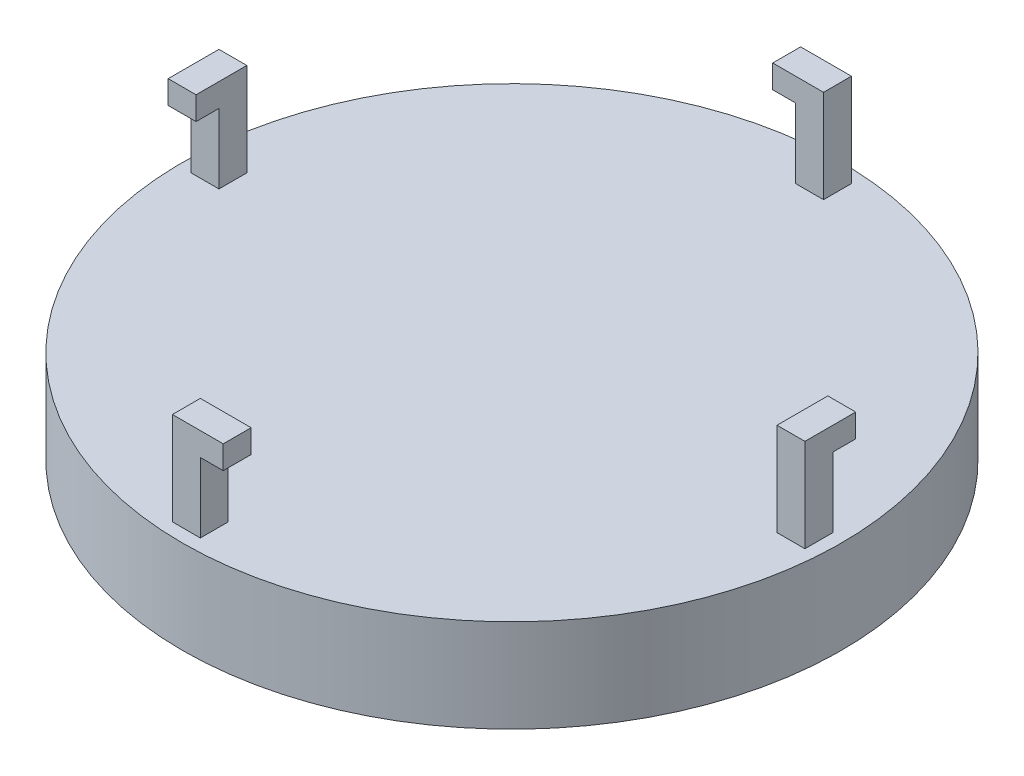
ISO-10303-21;
HEADER;
FILE_DESCRIPTION(('STEP AP214'),'2;1');
FILE_NAME('part.step','',(''),(''),'','','');
FILE_SCHEMA(('AUTOMOTIVE_DESIGN { 1 0 10303 214 1 1 1 1 }'));
ENDSEC;
DATA;
#1=APPLICATION_CONTEXT('core data for automotive mechanical design processes');
#2=APPLICATION_PROTOCOL_DEFINITION('international standard','automotive_design',2000,#1);
#3=PRODUCT_CONTEXT('',#1,'mechanical');
#4=PRODUCT('Part','Part','',(#3));
#5=PRODUCT_RELATED_PRODUCT_CATEGORY('part','',(#4));
#6=PRODUCT_DEFINITION_FORMATION('','',#4);
#7=PRODUCT_DEFINITION_CONTEXT('part definition',#1,'design');
#8=PRODUCT_DEFINITION('design','',#6,#7);
#9=PRODUCT_DEFINITION_SHAPE('','',#8);
#10=(LENGTH_UNIT() NAMED_UNIT(*) SI_UNIT(.MILLI.,.METRE.));
#11=(NAMED_UNIT(*) PLANE_ANGLE_UNIT() SI_UNIT($,.RADIAN.));
#12=(NAMED_UNIT(*) SI_UNIT($,.STERADIAN.) SOLID_ANGLE_UNIT());
#13=UNCERTAINTY_MEASURE_WITH_UNIT(LENGTH_MEASURE(1.E-05),#10,'distance_accuracy_value','');
#14=(GEOMETRIC_REPRESENTATION_CONTEXT(3) GLOBAL_UNCERTAINTY_ASSIGNED_CONTEXT((#13)) GLOBAL_UNIT_ASSIGNED_CONTEXT((#10,
#11,#12)) REPRESENTATION_CONTEXT('',''));
#15=CARTESIAN_POINT('',(0.,0.,0.));
#16=DIRECTION('',(0.,0.,1.));
#17=DIRECTION('',(1.,0.,0.));
#18=AXIS2_PLACEMENT_3D('',#15,#16,#17);
#19=CARTESIAN_POINT('',(-0.635000000000452,25.4,-43.18));
#20=DIRECTION('',(1.,0.,0.));
#21=DIRECTION('',(0.,0.,-1.));
#22=AXIS2_PLACEMENT_3D('',#19,#20,#21);
#23=PLANE('',#22);
#24=DIRECTION('',(0.,0.,1.));
#25=VECTOR('',#24,1.);
#26=CARTESIAN_POINT('',(-0.635000000000452,22.225,-43.18));
#27=LINE('',#26,#25);
#28=CARTESIAN_POINT('',(-0.635000000000452,22.225,-43.18));
#29=VERTEX_POINT('',#28);
#30=CARTESIAN_POINT('',(-0.635000000000412,22.225,-39.37));
#31=VERTEX_POINT('',#30);
#32=EDGE_CURVE('E240',#29,#31,#27,.T.);
#33=ORIENTED_EDGE('',*,*,#32,.F.);
#34=DIRECTION('',(0.,-1.,0.));
#35=VECTOR('',#34,1.);
#36=CARTESIAN_POINT('',(-0.635000000000452,25.4,-43.18));
#37=LINE('',#36,#35);
#38=CARTESIAN_POINT('',(-0.635000000000452,12.7,-43.18));
#39=VERTEX_POINT('',#38);
#40=EDGE_CURVE('E61',#29,#39,#37,.T.);
#41=ORIENTED_EDGE('',*,*,#40,.T.);
#42=DIRECTION('',(0.,0.,1.));
#43=VECTOR('',#42,1.);
#44=CARTESIAN_POINT('',(-0.635000000000452,12.7,-43.18));
#45=LINE('',#44,#43);
#46=CARTESIAN_POINT('',(-0.635000000000412,12.7,-39.37));
#47=VERTEX_POINT('',#46);
#48=EDGE_CURVE('E223',#39,#47,#45,.T.);
#49=ORIENTED_EDGE('',*,*,#48,.T.);
#50=DIRECTION('',(0.,-1.,0.));
#51=VECTOR('',#50,1.);
#52=CARTESIAN_POINT('',(-0.635000000000412,25.4,-39.37));
#53=LINE('',#52,#51);
#54=EDGE_CURVE('E308',#31,#47,#53,.T.);
#55=ORIENTED_EDGE('',*,*,#54,.F.);
#56=EDGE_LOOP('',(#33,#41,#49,#55));
#57=FACE_BOUND('',#56,.T.);
#58=ADVANCED_FACE('F45',(#57),#23,.F.);
#59=CARTESIAN_POINT('',(43.18,25.4,-0.635));
#60=DIRECTION('',(0.,0.,1.));
#61=DIRECTION('',(1.,0.,0.));
#62=AXIS2_PLACEMENT_3D('',#59,#60,#61);
#63=PLANE('',#62);
#64=DIRECTION('',(-1.,0.,0.));
#65=VECTOR('',#64,1.);
#66=CARTESIAN_POINT('',(43.18,22.225,-0.635));
#67=LINE('',#66,#65);
#68=CARTESIAN_POINT('',(43.18,22.225,-0.635));
#69=VERTEX_POINT('',#68);
#70=CARTESIAN_POINT('',(39.37,22.225,-0.635));
#71=VERTEX_POINT('',#70);
#72=EDGE_CURVE('E255',#69,#71,#67,.T.);
#73=ORIENTED_EDGE('',*,*,#72,.F.);
#74=DIRECTION('',(0.,-1.,0.));
#75=VECTOR('',#74,1.);
#76=CARTESIAN_POINT('',(43.18,25.4,-0.635));
#77=LINE('',#76,#75);
#78=CARTESIAN_POINT('',(43.18,12.7,-0.635));
#79=VERTEX_POINT('',#78);
#80=EDGE_CURVE('E69',#69,#79,#77,.T.);
#81=ORIENTED_EDGE('',*,*,#80,.T.);
#82=DIRECTION('',(-1.,0.,0.));
#83=VECTOR('',#82,1.);
#84=CARTESIAN_POINT('',(43.18,12.7,-0.635));
#85=LINE('',#84,#83);
#86=CARTESIAN_POINT('',(39.37,12.7,-0.635));
#87=VERTEX_POINT('',#86);
#88=EDGE_CURVE('E335',#79,#87,#85,.T.);
#89=ORIENTED_EDGE('',*,*,#88,.T.);
#90=DIRECTION('',(0.,-1.,0.));
#91=VECTOR('',#90,1.);
#92=CARTESIAN_POINT('',(39.37,25.4,-0.635));
#93=LINE('',#92,#91);
#94=EDGE_CURVE('E341',#71,#87,#93,.T.);
#95=ORIENTED_EDGE('',*,*,#94,.F.);
#96=EDGE_LOOP('',(#73,#81,#89,#95));
#97=FACE_BOUND('',#96,.T.);
#98=ADVANCED_FACE('F484',(#97),#63,.F.);
#99=CARTESIAN_POINT('',(0.635000000000151,25.4,43.18));
#100=DIRECTION('',(-1.,0.,0.));
#101=DIRECTION('',(0.,0.,1.));
#102=AXIS2_PLACEMENT_3D('',#99,#100,#101);
#103=PLANE('',#102);
#104=DIRECTION('',(0.,0.,-1.));
#105=VECTOR('',#104,1.);
#106=CARTESIAN_POINT('',(0.635000000000151,22.225,43.18));
#107=LINE('',#106,#105);
#108=CARTESIAN_POINT('',(0.635000000000151,22.225,43.18));
#109=VERTEX_POINT('',#108);
#110=CARTESIAN_POINT('',(0.635000000000137,22.225,39.37));
#111=VERTEX_POINT('',#110);
#112=EDGE_CURVE('E279',#109,#111,#107,.T.);
#113=ORIENTED_EDGE('',*,*,#112,.F.);
#114=DIRECTION('',(0.,-1.,0.));
#115=VECTOR('',#114,1.);
#116=CARTESIAN_POINT('',(0.635000000000151,25.4,43.18));
#117=LINE('',#116,#115);
#118=CARTESIAN_POINT('',(0.635000000000151,12.7,43.18));
#119=VERTEX_POINT('',#118);
#120=EDGE_CURVE('E392',#109,#119,#117,.T.);
#121=ORIENTED_EDGE('',*,*,#120,.T.);
#122=DIRECTION('',(0.,0.,-1.));
#123=VECTOR('',#122,1.);
#124=CARTESIAN_POINT('',(0.635000000000151,12.7,43.18));
#125=LINE('',#124,#123);
#126=CARTESIAN_POINT('',(0.635000000000137,12.7,39.37));
#127=VERTEX_POINT('',#126);
#128=EDGE_CURVE('E370',#119,#127,#125,.T.);
#129=ORIENTED_EDGE('',*,*,#128,.T.);
#130=DIRECTION('',(0.,-1.,0.));
#131=VECTOR('',#130,1.);
#132=CARTESIAN_POINT('',(0.635000000000137,25.4,39.37));
#133=LINE('',#132,#131);
#134=EDGE_CURVE('E376',#111,#127,#133,.T.);
#135=ORIENTED_EDGE('',*,*,#134,.F.);
#136=EDGE_LOOP('',(#113,#121,#129,#135));
#137=FACE_BOUND('',#136,.T.);
#138=ADVANCED_FACE('F489',(#137),#103,.F.);
#139=CARTESIAN_POINT('',(0.,12.7,0.));
#140=DIRECTION('',(0.,1.,0.));
#141=DIRECTION('',(0.,0.,1.));
#142=AXIS2_PLACEMENT_3D('',#139,#140,#141);
#143=PLANE('',#142);
#144=CARTESIAN_POINT('',(0.,12.7,0.));
#145=DIRECTION('',(0.,1.,0.));
#146=DIRECTION('',(0.,0.,1.));
#147=AXIS2_PLACEMENT_3D('',#144,#145,#146);
#148=CIRCLE('',#147,45.);
#149=CARTESIAN_POINT('',(0.,12.7,45.));
#150=VERTEX_POINT('',#149);
#151=EDGE_CURVE('E11',#150,#150,#148,.T.);
#152=ORIENTED_EDGE('',*,*,#151,.T.);
#153=EDGE_LOOP('',(#152));
#154=FACE_BOUND('',#153,.T.);
#155=DIRECTION('',(-1.,0.,0.));
#156=VECTOR('',#155,1.);
#157=CARTESIAN_POINT('',(-43.18,12.7,-3.175));
#158=LINE('',#157,#156);
#159=CARTESIAN_POINT('',(-39.37,12.7,-3.175));
#160=VERTEX_POINT('',#159);
#161=CARTESIAN_POINT('',(-43.18,12.7,-3.175));
#162=VERTEX_POINT('',#161);
#163=EDGE_CURVE('E442',#160,#162,#158,.T.);
#164=ORIENTED_EDGE('',*,*,#163,.F.);
#165=DIRECTION('',(0.,0.,-1.));
#166=VECTOR('',#165,1.);
#167=CARTESIAN_POINT('',(-39.37,12.7,-3.175));
#168=LINE('',#167,#166);
#169=CARTESIAN_POINT('',(-39.37,12.7,0.635));
#170=VERTEX_POINT('',#169);
#171=EDGE_CURVE('E426',#170,#160,#168,.T.);
#172=ORIENTED_EDGE('',*,*,#171,.F.);
#173=DIRECTION('',(1.,0.,0.));
#174=VECTOR('',#173,1.);
#175=CARTESIAN_POINT('',(-43.18,12.7,0.635));
#176=LINE('',#175,#174);
#177=CARTESIAN_POINT('',(-43.18,12.7,0.635));
#178=VERTEX_POINT('',#177);
#179=EDGE_CURVE('E432',#178,#170,#176,.T.);
#180=ORIENTED_EDGE('',*,*,#179,.F.);
#181=DIRECTION('',(0.,0.,1.));
#182=VECTOR('',#181,1.);
#183=CARTESIAN_POINT('',(-43.18,12.7,-3.175));
#184=LINE('',#183,#182);
#185=EDGE_CURVE('E445',#162,#178,#184,.T.);
#186=ORIENTED_EDGE('',*,*,#185,.F.);
#187=EDGE_LOOP('',(#164,#172,#180,#186));
#188=FACE_BOUND('',#187,.T.);
#189=DIRECTION('',(0.,0.,1.));
#190=VECTOR('',#189,1.);
#191=CARTESIAN_POINT('',(-3.17499999999985,12.7,43.18));
#192=LINE('',#191,#190);
#193=CARTESIAN_POINT('',(-3.17499999999986,12.7,39.37));
#194=VERTEX_POINT('',#193);
#195=CARTESIAN_POINT('',(-3.17499999999985,12.7,43.18));
#196=VERTEX_POINT('',#195);
#197=EDGE_CURVE('E380',#194,#196,#192,.T.);
#198=ORIENTED_EDGE('',*,*,#197,.F.);
#199=DIRECTION('',(-1.,0.,0.));
#200=VECTOR('',#199,1.);
#201=CARTESIAN_POINT('',(-3.17499999999986,12.7,39.37));
#202=LINE('',#201,#200);
#203=EDGE_CURVE('E364',#127,#194,#202,.T.);
#204=ORIENTED_EDGE('',*,*,#203,.F.);
#205=ORIENTED_EDGE('',*,*,#128,.F.);
#206=DIRECTION('',(1.,0.,0.));
#207=VECTOR('',#206,1.);
#208=CARTESIAN_POINT('',(-3.17499999999985,12.7,43.18));
#209=LINE('',#208,#207);
#210=EDGE_CURVE('E383',#196,#119,#209,.T.);
#211=ORIENTED_EDGE('',*,*,#210,.F.);
#212=EDGE_LOOP('',(#198,#204,#205,#211));
#213=FACE_BOUND('',#212,.T.);
#214=DIRECTION('',(1.,0.,0.));
#215=VECTOR('',#214,1.);
#216=CARTESIAN_POINT('',(43.18,12.7,3.175));
#217=LINE('',#216,#215);
#218=CARTESIAN_POINT('',(39.37,12.7,3.175));
#219=VERTEX_POINT('',#218);
#220=CARTESIAN_POINT('',(43.18,12.7,3.175));
#221=VERTEX_POINT('',#220);
#222=EDGE_CURVE('E345',#219,#221,#217,.T.);
#223=ORIENTED_EDGE('',*,*,#222,.F.);
#224=DIRECTION('',(0.,0.,1.));
#225=VECTOR('',#224,1.);
#226=CARTESIAN_POINT('',(39.37,12.7,3.175));
#227=LINE('',#226,#225);
#228=EDGE_CURVE('E329',#87,#219,#227,.T.);
#229=ORIENTED_EDGE('',*,*,#228,.F.);
#230=ORIENTED_EDGE('',*,*,#88,.F.);
#231=DIRECTION('',(0.,0.,-1.));
#232=VECTOR('',#231,1.);
#233=CARTESIAN_POINT('',(43.18,12.7,3.175));
#234=LINE('',#233,#232);
#235=EDGE_CURVE('E348',#221,#79,#234,.T.);
#236=ORIENTED_EDGE('',*,*,#235,.F.);
#237=EDGE_LOOP('',(#223,#229,#230,#236));
#238=FACE_BOUND('',#237,.T.);
#239=DIRECTION('',(0.,0.,-1.));
#240=VECTOR('',#239,1.);
#241=CARTESIAN_POINT('',(3.17499999999955,12.7,-43.18));
#242=LINE('',#241,#240);
#243=CARTESIAN_POINT('',(3.17499999999959,12.7,-39.37));
#244=VERTEX_POINT('',#243);
#245=CARTESIAN_POINT('',(3.17499999999955,12.7,-43.18));
#246=VERTEX_POINT('',#245);
#247=EDGE_CURVE('E311',#244,#246,#242,.T.);
#248=ORIENTED_EDGE('',*,*,#247,.F.);
#249=DIRECTION('',(1.,0.,0.));
#250=VECTOR('',#249,1.);
#251=CARTESIAN_POINT('',(3.17499999999959,12.7,-39.37));
#252=LINE('',#251,#250);
#253=EDGE_CURVE('E302',#47,#244,#252,.T.);
#254=ORIENTED_EDGE('',*,*,#253,.F.);
#255=ORIENTED_EDGE('',*,*,#48,.F.);
#256=DIRECTION('',(-1.,0.,0.));
#257=VECTOR('',#256,1.);
#258=CARTESIAN_POINT('',(3.17499999999955,12.7,-43.18));
#259=LINE('',#258,#257);
#260=EDGE_CURVE('E314',#246,#39,#259,.T.);
#261=ORIENTED_EDGE('',*,*,#260,.F.);
#262=EDGE_LOOP('',(#248,#254,#255,#261));
#263=FACE_BOUND('',#262,.T.);
#264=ADVANCED_FACE('F527',(#154,#188,#213,#238,#263),#143,.T.);
#265=CARTESIAN_POINT('',(-43.18,25.4,0.635));
#266=DIRECTION('',(0.,0.,-1.));
#267=DIRECTION('',(-1.,0.,0.));
#268=AXIS2_PLACEMENT_3D('',#265,#266,#267);
#269=PLANE('',#268);
#270=DIRECTION('',(1.,0.,0.));
#271=VECTOR('',#270,1.);
#272=CARTESIAN_POINT('',(-43.18,22.225,0.635));
#273=LINE('',#272,#271);
#274=CARTESIAN_POINT('',(-43.18,22.225,0.635));
#275=VERTEX_POINT('',#274);
#276=CARTESIAN_POINT('',(-39.37,22.225,0.635));
#277=VERTEX_POINT('',#276);
#278=EDGE_CURVE('E402',#275,#277,#273,.T.);
#279=ORIENTED_EDGE('',*,*,#278,.F.);
#280=DIRECTION('',(0.,-1.,0.));
#281=VECTOR('',#280,1.);
#282=CARTESIAN_POINT('',(-43.18,25.4,0.635));
#283=LINE('',#282,#281);
#284=EDGE_CURVE('E454',#275,#178,#283,.T.);
#285=ORIENTED_EDGE('',*,*,#284,.T.);
#286=ORIENTED_EDGE('',*,*,#179,.T.);
#287=DIRECTION('',(0.,-1.,0.));
#288=VECTOR('',#287,1.);
#289=CARTESIAN_POINT('',(-39.37,25.4,0.635));
#290=LINE('',#289,#288);
#291=EDGE_CURVE('E438',#277,#170,#290,.T.);
#292=ORIENTED_EDGE('',*,*,#291,.F.);
#293=EDGE_LOOP('',(#279,#285,#286,#292));
#294=FACE_BOUND('',#293,.T.);
#295=ADVANCED_FACE('F480',(#294),#269,.F.);
#296=CARTESIAN_POINT('',(0.,12.7,0.));
#297=DIRECTION('',(0.,-1.,0.));
#298=DIRECTION('',(0.,0.,-1.));
#299=AXIS2_PLACEMENT_3D('',#296,#297,#298);
#300=CYLINDRICAL_SURFACE('',#299,45.);
#301=ORIENTED_EDGE('',*,*,#151,.F.);
#302=EDGE_LOOP('',(#301));
#303=FACE_BOUND('',#302,.T.);
#304=CARTESIAN_POINT('',(0.,0.,0.));
#305=DIRECTION('',(0.,1.,0.));
#306=DIRECTION('',(0.,0.,1.));
#307=AXIS2_PLACEMENT_3D('',#304,#305,#306);
#308=CIRCLE('',#307,45.);
#309=CARTESIAN_POINT('',(0.,0.,45.));
#310=VERTEX_POINT('',#309);
#311=EDGE_CURVE('E49',#310,#310,#308,.T.);
#312=ORIENTED_EDGE('',*,*,#311,.T.);
#313=EDGE_LOOP('',(#312));
#314=FACE_BOUND('',#313,.T.);
#315=ADVANCED_FACE('F47',(#303,#314),#300,.T.);
#316=CARTESIAN_POINT('',(0.,0.,0.));
#317=DIRECTION('',(0.,1.,0.));
#318=DIRECTION('',(0.,0.,1.));
#319=AXIS2_PLACEMENT_3D('',#316,#317,#318);
#320=PLANE('',#319);
#321=ORIENTED_EDGE('',*,*,#311,.F.);
#322=EDGE_LOOP('',(#321));
#323=FACE_BOUND('',#322,.T.);
#324=ADVANCED_FACE('F470',(#323),#320,.F.);
#325=CARTESIAN_POINT('',(-39.37,25.4,-3.175));
#326=DIRECTION('',(-1.,0.,0.));
#327=DIRECTION('',(0.,0.,1.));
#328=AXIS2_PLACEMENT_3D('',#325,#326,#327);
#329=PLANE('',#328);
#330=ORIENTED_EDGE('',*,*,#171,.T.);
#331=DIRECTION('',(0.,-1.,0.));
#332=VECTOR('',#331,1.);
#333=CARTESIAN_POINT('',(-39.37,25.4,-3.175));
#334=LINE('',#333,#332);
#335=CARTESIAN_POINT('',(-39.37,25.4,-3.175));
#336=VERTEX_POINT('',#335);
#337=EDGE_CURVE('E461',#336,#160,#334,.T.);
#338=ORIENTED_EDGE('',*,*,#337,.F.);
#339=DIRECTION('',(0.,0.,-1.));
#340=VECTOR('',#339,1.);
#341=CARTESIAN_POINT('',(-39.37,25.4,-3.175));
#342=LINE('',#341,#340);
#343=CARTESIAN_POINT('',(-39.37,25.4,3.76));
#344=VERTEX_POINT('',#343);
#345=EDGE_CURVE('E427',#344,#336,#342,.T.);
#346=ORIENTED_EDGE('',*,*,#345,.F.);
#347=DIRECTION('',(0.,1.,0.));
#348=VECTOR('',#347,1.);
#349=CARTESIAN_POINT('',(-39.37,25.4,3.76));
#350=LINE('',#349,#348);
#351=CARTESIAN_POINT('',(-39.37,22.225,3.76));
#352=VERTEX_POINT('',#351);
#353=EDGE_CURVE('E403',#352,#344,#350,.T.);
#354=ORIENTED_EDGE('',*,*,#353,.F.);
#355=DIRECTION('',(0.,0.,-1.));
#356=VECTOR('',#355,1.);
#357=CARTESIAN_POINT('',(-39.37,22.225,3.76));
#358=LINE('',#357,#356);
#359=EDGE_CURVE('E417',#352,#277,#358,.T.);
#360=ORIENTED_EDGE('',*,*,#359,.T.);
#361=ORIENTED_EDGE('',*,*,#291,.T.);
#362=EDGE_LOOP('',(#330,#338,#346,#354,#360,#361));
#363=FACE_BOUND('',#362,.T.);
#364=ADVANCED_FACE('F472',(#363),#329,.F.);
#365=CARTESIAN_POINT('',(-43.18,25.4,-3.175));
#366=DIRECTION('',(0.,0.,1.));
#367=DIRECTION('',(1.,0.,0.));
#368=AXIS2_PLACEMENT_3D('',#365,#366,#367);
#369=PLANE('',#368);
#370=ORIENTED_EDGE('',*,*,#163,.T.);
#371=DIRECTION('',(0.,-1.,0.));
#372=VECTOR('',#371,1.);
#373=CARTESIAN_POINT('',(-43.18,25.4,-3.175));
#374=LINE('',#373,#372);
#375=CARTESIAN_POINT('',(-43.18,25.4,-3.175));
#376=VERTEX_POINT('',#375);
#377=EDGE_CURVE('E457',#376,#162,#374,.T.);
#378=ORIENTED_EDGE('',*,*,#377,.F.);
#379=DIRECTION('',(-1.,0.,0.));
#380=VECTOR('',#379,1.);
#381=CARTESIAN_POINT('',(-43.18,25.4,-3.175));
#382=LINE('',#381,#380);
#383=EDGE_CURVE('E431',#336,#376,#382,.T.);
#384=ORIENTED_EDGE('',*,*,#383,.F.);
#385=ORIENTED_EDGE('',*,*,#337,.T.);
#386=EDGE_LOOP('',(#370,#378,#384,#385));
#387=FACE_BOUND('',#386,.T.);
#388=ADVANCED_FACE('F477',(#387),#369,.F.);
#389=CARTESIAN_POINT('',(-43.18,25.4,-3.175));
#390=DIRECTION('',(1.,0.,0.));
#391=DIRECTION('',(0.,0.,-1.));
#392=AXIS2_PLACEMENT_3D('',#389,#390,#391);
#393=PLANE('',#392);
#394=ORIENTED_EDGE('',*,*,#185,.T.);
#395=ORIENTED_EDGE('',*,*,#284,.F.);
#396=DIRECTION('',(0.,0.,-1.));
#397=VECTOR('',#396,1.);
#398=CARTESIAN_POINT('',(-43.18,22.225,3.76));
#399=LINE('',#398,#397);
#400=CARTESIAN_POINT('',(-43.18,22.225,3.76));
#401=VERTEX_POINT('',#400);
#402=EDGE_CURVE('E423',#401,#275,#399,.T.);
#403=ORIENTED_EDGE('',*,*,#402,.F.);
#404=DIRECTION('',(0.,-1.,0.));
#405=VECTOR('',#404,1.);
#406=CARTESIAN_POINT('',(-43.18,25.4,3.76));
#407=LINE('',#406,#405);
#408=CARTESIAN_POINT('',(-43.18,25.4,3.76));
#409=VERTEX_POINT('',#408);
#410=EDGE_CURVE('E411',#409,#401,#407,.T.);
#411=ORIENTED_EDGE('',*,*,#410,.F.);
#412=DIRECTION('',(0.,0.,1.));
#413=VECTOR('',#412,1.);
#414=CARTESIAN_POINT('',(-43.18,25.4,-3.175));
#415=LINE('',#414,#413);
#416=EDGE_CURVE('E435',#376,#409,#415,.T.);
#417=ORIENTED_EDGE('',*,*,#416,.F.);
#418=ORIENTED_EDGE('',*,*,#377,.T.);
#419=EDGE_LOOP('',(#394,#395,#403,#411,#417,#418));
#420=FACE_BOUND('',#419,.T.);
#421=ADVANCED_FACE('F551',(#420),#393,.F.);
#422=CARTESIAN_POINT('',(0.,25.4,0.));
#423=DIRECTION('',(0.,1.,0.));
#424=DIRECTION('',(0.,0.,1.));
#425=AXIS2_PLACEMENT_3D('',#422,#423,#424);
#426=PLANE('',#425);
#427=ORIENTED_EDGE('',*,*,#345,.T.);
#428=ORIENTED_EDGE('',*,*,#383,.T.);
#429=ORIENTED_EDGE('',*,*,#416,.T.);
#430=DIRECTION('',(-1.,0.,0.));
#431=VECTOR('',#430,1.);
#432=CARTESIAN_POINT('',(-43.18,25.4,3.76));
#433=LINE('',#432,#431);
#434=EDGE_CURVE('E407',#344,#409,#433,.T.);
#435=ORIENTED_EDGE('',*,*,#434,.F.);
#436=EDGE_LOOP('',(#427,#428,#429,#435));
#437=FACE_BOUND('',#436,.T.);
#438=ADVANCED_FACE('F547',(#437),#426,.T.);
#439=CARTESIAN_POINT('',(-43.18,22.225,3.76));
#440=DIRECTION('',(0.,1.,0.));
#441=DIRECTION('',(-1.,0.,0.));
#442=AXIS2_PLACEMENT_3D('',#439,#440,#441);
#443=PLANE('',#442);
#444=ORIENTED_EDGE('',*,*,#278,.T.);
#445=ORIENTED_EDGE('',*,*,#359,.F.);
#446=DIRECTION('',(1.,0.,0.));
#447=VECTOR('',#446,1.);
#448=CARTESIAN_POINT('',(-43.18,22.225,3.76));
#449=LINE('',#448,#447);
#450=EDGE_CURVE('E414',#401,#352,#449,.T.);
#451=ORIENTED_EDGE('',*,*,#450,.F.);
#452=ORIENTED_EDGE('',*,*,#402,.T.);
#453=EDGE_LOOP('',(#444,#445,#451,#452));
#454=FACE_BOUND('',#453,.T.);
#455=ADVANCED_FACE('F543',(#454),#443,.F.);
#456=CARTESIAN_POINT('',(0.,0.,3.76));
#457=DIRECTION('',(0.,0.,1.));
#458=DIRECTION('',(1.,0.,0.));
#459=AXIS2_PLACEMENT_3D('',#456,#457,#458);
#460=PLANE('',#459);
#461=ORIENTED_EDGE('',*,*,#353,.T.);
#462=ORIENTED_EDGE('',*,*,#434,.T.);
#463=ORIENTED_EDGE('',*,*,#410,.T.);
#464=ORIENTED_EDGE('',*,*,#450,.T.);
#465=EDGE_LOOP('',(#461,#462,#463,#464));
#466=FACE_BOUND('',#465,.T.);
#467=ADVANCED_FACE('F539',(#466),#460,.T.);
#468=CARTESIAN_POINT('',(-3.17499999999986,25.4,39.37));
#469=DIRECTION('',(0.,0.,1.));
#470=DIRECTION('',(1.,0.,0.));
#471=AXIS2_PLACEMENT_3D('',#468,#469,#470);
#472=PLANE('',#471);
#473=ORIENTED_EDGE('',*,*,#203,.T.);
#474=DIRECTION('',(0.,-1.,0.));
#475=VECTOR('',#474,1.);
#476=CARTESIAN_POINT('',(-3.17499999999986,25.4,39.37));
#477=LINE('',#476,#475);
#478=CARTESIAN_POINT('',(-3.17499999999986,25.4,39.37));
#479=VERTEX_POINT('',#478);
#480=EDGE_CURVE('E399',#479,#194,#477,.T.);
#481=ORIENTED_EDGE('',*,*,#480,.F.);
#482=DIRECTION('',(-1.,0.,0.));
#483=VECTOR('',#482,1.);
#484=CARTESIAN_POINT('',(-3.17499999999986,25.4,39.37));
#485=LINE('',#484,#483);
#486=CARTESIAN_POINT('',(3.76000000000014,25.4,39.37));
#487=VERTEX_POINT('',#486);
#488=EDGE_CURVE('E365',#487,#479,#485,.T.);
#489=ORIENTED_EDGE('',*,*,#488,.F.);
#490=DIRECTION('',(0.,1.,0.));
#491=VECTOR('',#490,1.);
#492=CARTESIAN_POINT('',(3.76000000000014,25.4,39.37));
#493=LINE('',#492,#491);
#494=CARTESIAN_POINT('',(3.76000000000014,22.225,39.37));
#495=VERTEX_POINT('',#494);
#496=EDGE_CURVE('E280',#495,#487,#493,.T.);
#497=ORIENTED_EDGE('',*,*,#496,.F.);
#498=DIRECTION('',(-1.,0.,0.));
#499=VECTOR('',#498,1.);
#500=CARTESIAN_POINT('',(3.76000000000014,22.225,39.37));
#501=LINE('',#500,#499);
#502=EDGE_CURVE('E294',#495,#111,#501,.T.);
#503=ORIENTED_EDGE('',*,*,#502,.T.);
#504=ORIENTED_EDGE('',*,*,#134,.T.);
#505=EDGE_LOOP('',(#473,#481,#489,#497,#503,#504));
#506=FACE_BOUND('',#505,.T.);
#507=ADVANCED_FACE('F535',(#506),#472,.F.);
#508=CARTESIAN_POINT('',(-3.17499999999985,25.4,43.18));
#509=DIRECTION('',(1.,0.,0.));
#510=DIRECTION('',(0.,0.,-1.));
#511=AXIS2_PLACEMENT_3D('',#508,#509,#510);
#512=PLANE('',#511);
#513=ORIENTED_EDGE('',*,*,#197,.T.);
#514=DIRECTION('',(0.,-1.,0.));
#515=VECTOR('',#514,1.);
#516=CARTESIAN_POINT('',(-3.17499999999985,25.4,43.18));
#517=LINE('',#516,#515);
#518=CARTESIAN_POINT('',(-3.17499999999985,25.4,43.18));
#519=VERTEX_POINT('',#518);
#520=EDGE_CURVE('E395',#519,#196,#517,.T.);
#521=ORIENTED_EDGE('',*,*,#520,.F.);
#522=DIRECTION('',(0.,0.,1.));
#523=VECTOR('',#522,1.);
#524=CARTESIAN_POINT('',(-3.17499999999985,25.4,43.18));
#525=LINE('',#524,#523);
#526=EDGE_CURVE('E369',#479,#519,#525,.T.);
#527=ORIENTED_EDGE('',*,*,#526,.F.);
#528=ORIENTED_EDGE('',*,*,#480,.T.);
#529=EDGE_LOOP('',(#513,#521,#527,#528));
#530=FACE_BOUND('',#529,.T.);
#531=ADVANCED_FACE('F531',(#530),#512,.F.);
#532=CARTESIAN_POINT('',(-3.17499999999985,25.4,43.18));
#533=DIRECTION('',(0.,0.,-1.));
#534=DIRECTION('',(-1.,0.,0.));
#535=AXIS2_PLACEMENT_3D('',#532,#533,#534);
#536=PLANE('',#535);
#537=ORIENTED_EDGE('',*,*,#210,.T.);
#538=ORIENTED_EDGE('',*,*,#120,.F.);
#539=DIRECTION('',(-1.,0.,0.));
#540=VECTOR('',#539,1.);
#541=CARTESIAN_POINT('',(3.76000000000015,22.225,43.18));
#542=LINE('',#541,#540);
#543=CARTESIAN_POINT('',(3.76000000000015,22.225,43.18));
#544=VERTEX_POINT('',#543);
#545=EDGE_CURVE('E300',#544,#109,#542,.T.);
#546=ORIENTED_EDGE('',*,*,#545,.F.);
#547=DIRECTION('',(0.,-1.,0.));
#548=VECTOR('',#547,1.);
#549=CARTESIAN_POINT('',(3.76000000000015,25.4,43.18));
#550=LINE('',#549,#548);
#551=CARTESIAN_POINT('',(3.76000000000015,25.4,43.18));
#552=VERTEX_POINT('',#551);
#553=EDGE_CURVE('E288',#552,#544,#550,.T.);
#554=ORIENTED_EDGE('',*,*,#553,.F.);
#555=DIRECTION('',(1.,0.,0.));
#556=VECTOR('',#555,1.);
#557=CARTESIAN_POINT('',(-3.17499999999985,25.4,43.18));
#558=LINE('',#557,#556);
#559=EDGE_CURVE('E373',#519,#552,#558,.T.);
#560=ORIENTED_EDGE('',*,*,#559,.F.);
#561=ORIENTED_EDGE('',*,*,#520,.T.);
#562=EDGE_LOOP('',(#537,#538,#546,#554,#560,#561));
#563=FACE_BOUND('',#562,.T.);
#564=ADVANCED_FACE('F523',(#563),#536,.F.);
#565=CARTESIAN_POINT('',(0.,25.4,0.));
#566=DIRECTION('',(0.,1.,0.));
#567=DIRECTION('',(1.,0.,0.));
#568=AXIS2_PLACEMENT_3D('',#565,#566,#567);
#569=PLANE('',#568);
#570=ORIENTED_EDGE('',*,*,#488,.T.);
#571=ORIENTED_EDGE('',*,*,#526,.T.);
#572=ORIENTED_EDGE('',*,*,#559,.T.);
#573=DIRECTION('',(0.,0.,1.));
#574=VECTOR('',#573,1.);
#575=CARTESIAN_POINT('',(3.76000000000015,25.4,43.18));
#576=LINE('',#575,#574);
#577=EDGE_CURVE('E284',#487,#552,#576,.T.);
#578=ORIENTED_EDGE('',*,*,#577,.F.);
#579=EDGE_LOOP('',(#570,#571,#572,#578));
#580=FACE_BOUND('',#579,.T.);
#581=ADVANCED_FACE('F519',(#580),#569,.T.);
#582=CARTESIAN_POINT('',(39.37,25.4,3.175));
#583=DIRECTION('',(1.,0.,0.));
#584=DIRECTION('',(0.,0.,-1.));
#585=AXIS2_PLACEMENT_3D('',#582,#583,#584);
#586=PLANE('',#585);
#587=ORIENTED_EDGE('',*,*,#228,.T.);
#588=DIRECTION('',(0.,-1.,0.));
#589=VECTOR('',#588,1.);
#590=CARTESIAN_POINT('',(39.37,25.4,3.175));
#591=LINE('',#590,#589);
#592=CARTESIAN_POINT('',(39.37,25.4,3.175));
#593=VERTEX_POINT('',#592);
#594=EDGE_CURVE('E361',#593,#219,#591,.T.);
#595=ORIENTED_EDGE('',*,*,#594,.F.);
#596=DIRECTION('',(0.,0.,1.));
#597=VECTOR('',#596,1.);
#598=CARTESIAN_POINT('',(39.37,25.4,3.175));
#599=LINE('',#598,#597);
#600=CARTESIAN_POINT('',(39.37,25.4,-3.76));
#601=VERTEX_POINT('',#600);
#602=EDGE_CURVE('E330',#601,#593,#599,.T.);
#603=ORIENTED_EDGE('',*,*,#602,.F.);
#604=DIRECTION('',(0.,1.,0.));
#605=VECTOR('',#604,1.);
#606=CARTESIAN_POINT('',(39.37,25.4,-3.76));
#607=LINE('',#606,#605);
#608=CARTESIAN_POINT('',(39.37,22.225,-3.76));
#609=VERTEX_POINT('',#608);
#610=EDGE_CURVE('E256',#609,#601,#607,.T.);
#611=ORIENTED_EDGE('',*,*,#610,.F.);
#612=DIRECTION('',(0.,0.,1.));
#613=VECTOR('',#612,1.);
#614=CARTESIAN_POINT('',(39.37,22.225,-3.76));
#615=LINE('',#614,#613);
#616=EDGE_CURVE('E270',#609,#71,#615,.T.);
#617=ORIENTED_EDGE('',*,*,#616,.T.);
#618=ORIENTED_EDGE('',*,*,#94,.T.);
#619=EDGE_LOOP('',(#587,#595,#603,#611,#617,#618));
#620=FACE_BOUND('',#619,.T.);
#621=ADVANCED_FACE('F515',(#620),#586,.F.);
#622=CARTESIAN_POINT('',(43.18,25.4,3.175));
#623=DIRECTION('',(0.,0.,-1.));
#624=DIRECTION('',(-1.,0.,0.));
#625=AXIS2_PLACEMENT_3D('',#622,#623,#624);
#626=PLANE('',#625);
#627=ORIENTED_EDGE('',*,*,#222,.T.);
#628=DIRECTION('',(0.,-1.,0.));
#629=VECTOR('',#628,1.);
#630=CARTESIAN_POINT('',(43.18,25.4,3.175));
#631=LINE('',#630,#629);
#632=CARTESIAN_POINT('',(43.18,25.4,3.175));
#633=VERTEX_POINT('',#632);
#634=EDGE_CURVE('E357',#633,#221,#631,.T.);
#635=ORIENTED_EDGE('',*,*,#634,.F.);
#636=DIRECTION('',(1.,0.,0.));
#637=VECTOR('',#636,1.);
#638=CARTESIAN_POINT('',(43.18,25.4,3.175));
#639=LINE('',#638,#637);
#640=EDGE_CURVE('E334',#593,#633,#639,.T.);
#641=ORIENTED_EDGE('',*,*,#640,.F.);
#642=ORIENTED_EDGE('',*,*,#594,.T.);
#643=EDGE_LOOP('',(#627,#635,#641,#642));
#644=FACE_BOUND('',#643,.T.);
#645=ADVANCED_FACE('F511',(#644),#626,.F.);
#646=CARTESIAN_POINT('',(43.18,25.4,3.175));
#647=DIRECTION('',(-1.,0.,0.));
#648=DIRECTION('',(0.,0.,1.));
#649=AXIS2_PLACEMENT_3D('',#646,#647,#648);
#650=PLANE('',#649);
#651=ORIENTED_EDGE('',*,*,#235,.T.);
#652=ORIENTED_EDGE('',*,*,#80,.F.);
#653=DIRECTION('',(0.,0.,1.));
#654=VECTOR('',#653,1.);
#655=CARTESIAN_POINT('',(43.18,22.225,-3.76));
#656=LINE('',#655,#654);
#657=CARTESIAN_POINT('',(43.18,22.225,-3.76));
#658=VERTEX_POINT('',#657);
#659=EDGE_CURVE('E276',#658,#69,#656,.T.);
#660=ORIENTED_EDGE('',*,*,#659,.F.);
#661=DIRECTION('',(0.,-1.,0.));
#662=VECTOR('',#661,1.);
#663=CARTESIAN_POINT('',(43.18,25.4,-3.76));
#664=LINE('',#663,#662);
#665=CARTESIAN_POINT('',(43.18,25.4,-3.76));
#666=VERTEX_POINT('',#665);
#667=EDGE_CURVE('E264',#666,#658,#664,.T.);
#668=ORIENTED_EDGE('',*,*,#667,.F.);
#669=DIRECTION('',(0.,0.,-1.));
#670=VECTOR('',#669,1.);
#671=CARTESIAN_POINT('',(43.18,25.4,3.175));
#672=LINE('',#671,#670);
#673=EDGE_CURVE('E338',#633,#666,#672,.T.);
#674=ORIENTED_EDGE('',*,*,#673,.F.);
#675=ORIENTED_EDGE('',*,*,#634,.T.);
#676=EDGE_LOOP('',(#651,#652,#660,#668,#674,#675));
#677=FACE_BOUND('',#676,.T.);
#678=ADVANCED_FACE('F506',(#677),#650,.F.);
#679=CARTESIAN_POINT('',(0.,25.4,0.));
#680=DIRECTION('',(0.,1.,0.));
#681=DIRECTION('',(0.,0.,-1.));
#682=AXIS2_PLACEMENT_3D('',#679,#680,#681);
#683=PLANE('',#682);
#684=ORIENTED_EDGE('',*,*,#602,.T.);
#685=ORIENTED_EDGE('',*,*,#640,.T.);
#686=ORIENTED_EDGE('',*,*,#673,.T.);
#687=DIRECTION('',(1.,0.,0.));
#688=VECTOR('',#687,1.);
#689=CARTESIAN_POINT('',(43.18,25.4,-3.76));
#690=LINE('',#689,#688);
#691=EDGE_CURVE('E260',#601,#666,#690,.T.);
#692=ORIENTED_EDGE('',*,*,#691,.F.);
#693=EDGE_LOOP('',(#684,#685,#686,#692));
#694=FACE_BOUND('',#693,.T.);
#695=ADVANCED_FACE('F504',(#694),#683,.T.);
#696=CARTESIAN_POINT('',(3.17499999999959,25.4,-39.37));
#697=DIRECTION('',(0.,0.,-1.));
#698=DIRECTION('',(-1.,0.,0.));
#699=AXIS2_PLACEMENT_3D('',#696,#697,#698);
#700=PLANE('',#699);
#701=ORIENTED_EDGE('',*,*,#253,.T.);
#702=DIRECTION('',(0.,-1.,0.));
#703=VECTOR('',#702,1.);
#704=CARTESIAN_POINT('',(3.17499999999959,25.4,-39.37));
#705=LINE('',#704,#703);
#706=CARTESIAN_POINT('',(3.17499999999959,25.4,-39.37));
#707=VERTEX_POINT('',#706);
#708=EDGE_CURVE('E219',#707,#244,#705,.T.);
#709=ORIENTED_EDGE('',*,*,#708,.F.);
#710=DIRECTION('',(1.,0.,0.));
#711=VECTOR('',#710,1.);
#712=CARTESIAN_POINT('',(3.17499999999959,25.4,-39.37));
#713=LINE('',#712,#711);
#714=CARTESIAN_POINT('',(-3.76000000000041,25.4,-39.37));
#715=VERTEX_POINT('',#714);
#716=EDGE_CURVE('E212',#715,#707,#713,.T.);
#717=ORIENTED_EDGE('',*,*,#716,.F.);
#718=DIRECTION('',(0.,1.,0.));
#719=VECTOR('',#718,1.);
#720=CARTESIAN_POINT('',(-3.76000000000041,25.4,-39.37));
#721=LINE('',#720,#719);
#722=CARTESIAN_POINT('',(-3.76000000000041,22.225,-39.37));
#723=VERTEX_POINT('',#722);
#724=EDGE_CURVE('E218',#723,#715,#721,.T.);
#725=ORIENTED_EDGE('',*,*,#724,.F.);
#726=DIRECTION('',(1.,0.,0.));
#727=VECTOR('',#726,1.);
#728=CARTESIAN_POINT('',(-3.76000000000041,22.225,-39.37));
#729=LINE('',#728,#727);
#730=EDGE_CURVE('E248',#723,#31,#729,.T.);
#731=ORIENTED_EDGE('',*,*,#730,.T.);
#732=ORIENTED_EDGE('',*,*,#54,.T.);
#733=EDGE_LOOP('',(#701,#709,#717,#725,#731,#732));
#734=FACE_BOUND('',#733,.T.);
#735=ADVANCED_FACE('F215',(#734),#700,.F.);
#736=CARTESIAN_POINT('',(3.17499999999955,25.4,-43.18));
#737=DIRECTION('',(-1.,0.,0.));
#738=DIRECTION('',(0.,0.,1.));
#739=AXIS2_PLACEMENT_3D('',#736,#737,#738);
#740=PLANE('',#739);
#741=ORIENTED_EDGE('',*,*,#247,.T.);
#742=DIRECTION('',(0.,-1.,0.));
#743=VECTOR('',#742,1.);
#744=CARTESIAN_POINT('',(3.17499999999955,25.4,-43.18));
#745=LINE('',#744,#743);
#746=CARTESIAN_POINT('',(3.17499999999955,25.4,-43.18));
#747=VERTEX_POINT('',#746);
#748=EDGE_CURVE('E323',#747,#246,#745,.T.);
#749=ORIENTED_EDGE('',*,*,#748,.F.);
#750=DIRECTION('',(0.,0.,-1.));
#751=VECTOR('',#750,1.);
#752=CARTESIAN_POINT('',(3.17499999999955,25.4,-43.18));
#753=LINE('',#752,#751);
#754=EDGE_CURVE('E222',#707,#747,#753,.T.);
#755=ORIENTED_EDGE('',*,*,#754,.F.);
#756=ORIENTED_EDGE('',*,*,#708,.T.);
#757=EDGE_LOOP('',(#741,#749,#755,#756));
#758=FACE_BOUND('',#757,.T.);
#759=ADVANCED_FACE('F497',(#758),#740,.F.);
#760=CARTESIAN_POINT('',(3.17499999999955,25.4,-43.18));
#761=DIRECTION('',(0.,0.,1.));
#762=DIRECTION('',(1.,0.,0.));
#763=AXIS2_PLACEMENT_3D('',#760,#761,#762);
#764=PLANE('',#763);
#765=ORIENTED_EDGE('',*,*,#260,.T.);
#766=ORIENTED_EDGE('',*,*,#40,.F.);
#767=DIRECTION('',(1.,0.,0.));
#768=VECTOR('',#767,1.);
#769=CARTESIAN_POINT('',(-3.76000000000045,22.225,-43.18));
#770=LINE('',#769,#768);
#771=CARTESIAN_POINT('',(-3.76000000000045,22.225,-43.18));
#772=VERTEX_POINT('',#771);
#773=EDGE_CURVE('E252',#772,#29,#770,.T.);
#774=ORIENTED_EDGE('',*,*,#773,.F.);
#775=DIRECTION('',(0.,-1.,0.));
#776=VECTOR('',#775,1.);
#777=CARTESIAN_POINT('',(-3.76000000000045,25.4,-43.18));
#778=LINE('',#777,#776);
#779=CARTESIAN_POINT('',(-3.76000000000045,25.4,-43.18));
#780=VERTEX_POINT('',#779);
#781=EDGE_CURVE('E233',#780,#772,#778,.T.);
#782=ORIENTED_EDGE('',*,*,#781,.F.);
#783=DIRECTION('',(-1.,0.,0.));
#784=VECTOR('',#783,1.);
#785=CARTESIAN_POINT('',(3.17499999999955,25.4,-43.18));
#786=LINE('',#785,#784);
#787=EDGE_CURVE('E229',#747,#780,#786,.T.);
#788=ORIENTED_EDGE('',*,*,#787,.F.);
#789=ORIENTED_EDGE('',*,*,#748,.T.);
#790=EDGE_LOOP('',(#765,#766,#774,#782,#788,#789));
#791=FACE_BOUND('',#790,.T.);
#792=ADVANCED_FACE('F494',(#791),#764,.F.);
#793=CARTESIAN_POINT('',(0.,25.4,0.));
#794=DIRECTION('',(0.,1.,0.));
#795=DIRECTION('',(-1.,0.,0.));
#796=AXIS2_PLACEMENT_3D('',#793,#794,#795);
#797=PLANE('',#796);
#798=ORIENTED_EDGE('',*,*,#716,.T.);
#799=ORIENTED_EDGE('',*,*,#754,.T.);
#800=ORIENTED_EDGE('',*,*,#787,.T.);
#801=DIRECTION('',(0.,0.,-1.));
#802=VECTOR('',#801,1.);
#803=CARTESIAN_POINT('',(-3.76000000000045,25.4,-43.18));
#804=LINE('',#803,#802);
#805=EDGE_CURVE('E226',#715,#780,#804,.T.);
#806=ORIENTED_EDGE('',*,*,#805,.F.);
#807=EDGE_LOOP('',(#798,#799,#800,#806));
#808=FACE_BOUND('',#807,.T.);
#809=ADVANCED_FACE('F227',(#808),#797,.T.);
#810=CARTESIAN_POINT('',(3.76000000000015,22.225,43.18));
#811=DIRECTION('',(0.,1.,0.));
#812=DIRECTION('',(0.,0.,1.));
#813=AXIS2_PLACEMENT_3D('',#810,#811,#812);
#814=PLANE('',#813);
#815=ORIENTED_EDGE('',*,*,#112,.T.);
#816=ORIENTED_EDGE('',*,*,#502,.F.);
#817=DIRECTION('',(0.,0.,-1.));
#818=VECTOR('',#817,1.);
#819=CARTESIAN_POINT('',(3.76000000000015,22.225,43.18));
#820=LINE('',#819,#818);
#821=EDGE_CURVE('E291',#544,#495,#820,.T.);
#822=ORIENTED_EDGE('',*,*,#821,.F.);
#823=ORIENTED_EDGE('',*,*,#545,.T.);
#824=EDGE_LOOP('',(#815,#816,#822,#823));
#825=FACE_BOUND('',#824,.T.);
#826=ADVANCED_FACE('F604',(#825),#814,.F.);
#827=CARTESIAN_POINT('',(3.76,0.,0.));
#828=DIRECTION('',(1.,0.,0.));
#829=DIRECTION('',(0.,0.,-1.));
#830=AXIS2_PLACEMENT_3D('',#827,#828,#829);
#831=PLANE('',#830);
#832=ORIENTED_EDGE('',*,*,#496,.T.);
#833=ORIENTED_EDGE('',*,*,#577,.T.);
#834=ORIENTED_EDGE('',*,*,#553,.T.);
#835=ORIENTED_EDGE('',*,*,#821,.T.);
#836=EDGE_LOOP('',(#832,#833,#834,#835));
#837=FACE_BOUND('',#836,.T.);
#838=ADVANCED_FACE('F601',(#837),#831,.T.);
#839=CARTESIAN_POINT('',(43.18,22.225,-3.76));
#840=DIRECTION('',(0.,1.,0.));
#841=DIRECTION('',(-1.,0.,0.));
#842=AXIS2_PLACEMENT_3D('',#839,#840,#841);
#843=PLANE('',#842);
#844=ORIENTED_EDGE('',*,*,#72,.T.);
#845=ORIENTED_EDGE('',*,*,#616,.F.);
#846=DIRECTION('',(-1.,0.,0.));
#847=VECTOR('',#846,1.);
#848=CARTESIAN_POINT('',(43.18,22.225,-3.76));
#849=LINE('',#848,#847);
#850=EDGE_CURVE('E267',#658,#609,#849,.T.);
#851=ORIENTED_EDGE('',*,*,#850,.F.);
#852=ORIENTED_EDGE('',*,*,#659,.T.);
#853=EDGE_LOOP('',(#844,#845,#851,#852));
#854=FACE_BOUND('',#853,.T.);
#855=ADVANCED_FACE('F595',(#854),#843,.F.);
#856=CARTESIAN_POINT('',(0.,0.,-3.76));
#857=DIRECTION('',(0.,0.,-1.));
#858=DIRECTION('',(-1.,0.,0.));
#859=AXIS2_PLACEMENT_3D('',#856,#857,#858);
#860=PLANE('',#859);
#861=ORIENTED_EDGE('',*,*,#610,.T.);
#862=ORIENTED_EDGE('',*,*,#691,.T.);
#863=ORIENTED_EDGE('',*,*,#667,.T.);
#864=ORIENTED_EDGE('',*,*,#850,.T.);
#865=EDGE_LOOP('',(#861,#862,#863,#864));
#866=FACE_BOUND('',#865,.T.);
#867=ADVANCED_FACE('F588',(#866),#860,.T.);
#868=CARTESIAN_POINT('',(-3.76000000000045,22.225,-43.18));
#869=DIRECTION('',(0.,1.,0.));
#870=DIRECTION('',(0.,0.,1.));
#871=AXIS2_PLACEMENT_3D('',#868,#869,#870);
#872=PLANE('',#871);
#873=ORIENTED_EDGE('',*,*,#32,.T.);
#874=ORIENTED_EDGE('',*,*,#730,.F.);
#875=DIRECTION('',(0.,0.,1.));
#876=VECTOR('',#875,1.);
#877=CARTESIAN_POINT('',(-3.76000000000045,22.225,-43.18));
#878=LINE('',#877,#876);
#879=EDGE_CURVE('E237',#772,#723,#878,.T.);
#880=ORIENTED_EDGE('',*,*,#879,.F.);
#881=ORIENTED_EDGE('',*,*,#773,.T.);
#882=EDGE_LOOP('',(#873,#874,#880,#881));
#883=FACE_BOUND('',#882,.T.);
#884=ADVANCED_FACE('F585',(#883),#872,.F.);
#885=CARTESIAN_POINT('',(-3.76,0.,0.));
#886=DIRECTION('',(-1.,0.,0.));
#887=DIRECTION('',(0.,0.,1.));
#888=AXIS2_PLACEMENT_3D('',#885,#886,#887);
#889=PLANE('',#888);
#890=ORIENTED_EDGE('',*,*,#724,.T.);
#891=ORIENTED_EDGE('',*,*,#805,.T.);
#892=ORIENTED_EDGE('',*,*,#781,.T.);
#893=ORIENTED_EDGE('',*,*,#879,.T.);
#894=EDGE_LOOP('',(#890,#891,#892,#893));
#895=FACE_BOUND('',#894,.T.);
#896=ADVANCED_FACE('F235',(#895),#889,.T.);
#897=CLOSED_SHELL('',(#58,#98,#138,#264,#295,#315,#324,#364,#388,#421,#438,#455,#467,#507,#531,
#564,#581,#621,#645,#678,#695,#735,#759,#792,#809,#826,#838,#855,#867,#884,#896));
#898=MANIFOLD_SOLID_BREP('B2',#897);
#899=ADVANCED_BREP_SHAPE_REPRESENTATION('',(#18,#898),#14);
#900=SHAPE_DEFINITION_REPRESENTATION(#9,#899);
ENDSEC;
END-ISO-10303-21;
